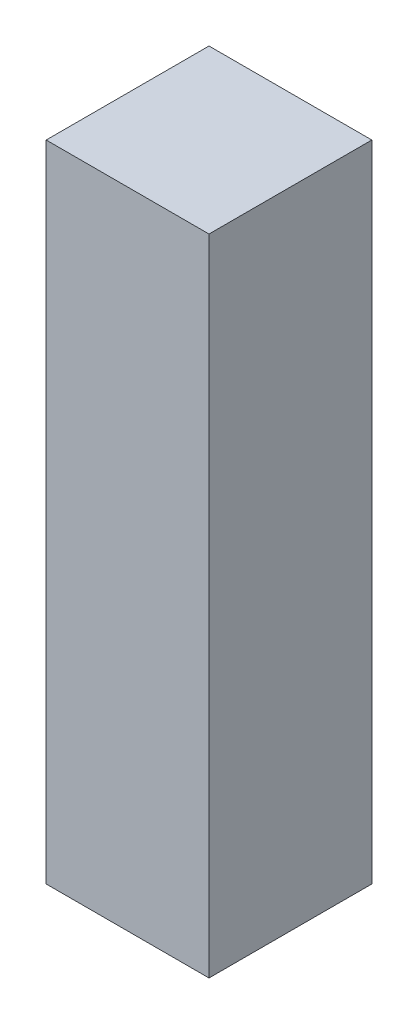
ISO-10303-21;
HEADER;
FILE_DESCRIPTION(('STEP AP214'),'2;1');
FILE_NAME('part.step','',(''),(''),'','','');
FILE_SCHEMA(('AUTOMOTIVE_DESIGN { 1 0 10303 214 1 1 1 1 }'));
ENDSEC;
DATA;
#1=APPLICATION_CONTEXT('core data for automotive mechanical design processes');
#2=APPLICATION_PROTOCOL_DEFINITION('international standard','automotive_design',2000,#1);
#3=PRODUCT_CONTEXT('',#1,'mechanical');
#4=PRODUCT('Part','Part','',(#3));
#5=PRODUCT_RELATED_PRODUCT_CATEGORY('part','',(#4));
#6=PRODUCT_DEFINITION_FORMATION('','',#4);
#7=PRODUCT_DEFINITION_CONTEXT('part definition',#1,'design');
#8=PRODUCT_DEFINITION('design','',#6,#7);
#9=PRODUCT_DEFINITION_SHAPE('','',#8);
#10=(LENGTH_UNIT() NAMED_UNIT(*) SI_UNIT(.MILLI.,.METRE.));
#11=(NAMED_UNIT(*) PLANE_ANGLE_UNIT() SI_UNIT($,.RADIAN.));
#12=(NAMED_UNIT(*) SI_UNIT($,.STERADIAN.) SOLID_ANGLE_UNIT());
#13=UNCERTAINTY_MEASURE_WITH_UNIT(LENGTH_MEASURE(1.E-05),#10,'distance_accuracy_value','');
#14=(GEOMETRIC_REPRESENTATION_CONTEXT(3) GLOBAL_UNCERTAINTY_ASSIGNED_CONTEXT((#13)) GLOBAL_UNIT_ASSIGNED_CONTEXT((#10,
#11,#12)) REPRESENTATION_CONTEXT('',''));
#15=CARTESIAN_POINT('',(0.,0.,0.));
#16=DIRECTION('',(0.,0.,1.));
#17=DIRECTION('',(1.,0.,0.));
#18=AXIS2_PLACEMENT_3D('',#15,#16,#17);
#19=CARTESIAN_POINT('',(150.,1187.25,150.));
#20=DIRECTION('',(-1.,0.,0.));
#21=DIRECTION('',(0.,0.,1.));
#22=AXIS2_PLACEMENT_3D('',#19,#20,#21);
#23=PLANE('',#22);
#24=DIRECTION('',(0.,0.,-1.));
#25=VECTOR('',#24,1.);
#26=CARTESIAN_POINT('',(150.,0.,150.));
#27=LINE('',#26,#25);
#28=CARTESIAN_POINT('',(150.,0.,150.));
#29=VERTEX_POINT('',#28);
#30=CARTESIAN_POINT('',(150.,0.,-150.));
#31=VERTEX_POINT('',#30);
#32=EDGE_CURVE('E106',#29,#31,#27,.T.);
#33=ORIENTED_EDGE('',*,*,#32,.T.);
#34=DIRECTION('',(0.,-1.,0.));
#35=VECTOR('',#34,1.);
#36=CARTESIAN_POINT('',(150.,1187.25,-150.));
#37=LINE('',#36,#35);
#38=CARTESIAN_POINT('',(150.,1187.25,-150.));
#39=VERTEX_POINT('',#38);
#40=EDGE_CURVE('E11',#39,#31,#37,.T.);
#41=ORIENTED_EDGE('',*,*,#40,.F.);
#42=DIRECTION('',(0.,0.,-1.));
#43=VECTOR('',#42,1.);
#44=CARTESIAN_POINT('',(150.,1187.25,150.));
#45=LINE('',#44,#43);
#46=CARTESIAN_POINT('',(150.,1187.25,150.));
#47=VERTEX_POINT('',#46);
#48=EDGE_CURVE('E94',#47,#39,#45,.T.);
#49=ORIENTED_EDGE('',*,*,#48,.F.);
#50=DIRECTION('',(0.,-1.,0.));
#51=VECTOR('',#50,1.);
#52=CARTESIAN_POINT('',(150.,1187.25,150.));
#53=LINE('',#52,#51);
#54=EDGE_CURVE('E102',#47,#29,#53,.T.);
#55=ORIENTED_EDGE('',*,*,#54,.T.);
#56=EDGE_LOOP('',(#33,#41,#49,#55));
#57=FACE_BOUND('',#56,.T.);
#58=ADVANCED_FACE('F43',(#57),#23,.F.);
#59=CARTESIAN_POINT('',(-150.,1187.25,-150.));
#60=DIRECTION('',(0.,0.,1.));
#61=DIRECTION('',(1.,0.,0.));
#62=AXIS2_PLACEMENT_3D('',#59,#60,#61);
#63=PLANE('',#62);
#64=DIRECTION('',(-1.,0.,0.));
#65=VECTOR('',#64,1.);
#66=CARTESIAN_POINT('',(-150.,0.,-150.));
#67=LINE('',#66,#65);
#68=CARTESIAN_POINT('',(-150.,0.,-150.));
#69=VERTEX_POINT('',#68);
#70=EDGE_CURVE('E98',#31,#69,#67,.T.);
#71=ORIENTED_EDGE('',*,*,#70,.T.);
#72=DIRECTION('',(0.,-1.,0.));
#73=VECTOR('',#72,1.);
#74=CARTESIAN_POINT('',(-150.,1187.25,-150.));
#75=LINE('',#74,#73);
#76=CARTESIAN_POINT('',(-150.,1187.25,-150.));
#77=VERTEX_POINT('',#76);
#78=EDGE_CURVE('E51',#77,#69,#75,.T.);
#79=ORIENTED_EDGE('',*,*,#78,.F.);
#80=DIRECTION('',(-1.,0.,0.));
#81=VECTOR('',#80,1.);
#82=CARTESIAN_POINT('',(-150.,1187.25,-150.));
#83=LINE('',#82,#81);
#84=EDGE_CURVE('E89',#39,#77,#83,.T.);
#85=ORIENTED_EDGE('',*,*,#84,.F.);
#86=ORIENTED_EDGE('',*,*,#40,.T.);
#87=EDGE_LOOP('',(#71,#79,#85,#86));
#88=FACE_BOUND('',#87,.T.);
#89=ADVANCED_FACE('F97',(#88),#63,.F.);
#90=CARTESIAN_POINT('',(-150.,1187.25,150.));
#91=DIRECTION('',(1.,0.,0.));
#92=DIRECTION('',(0.,0.,-1.));
#93=AXIS2_PLACEMENT_3D('',#90,#91,#92);
#94=PLANE('',#93);
#95=DIRECTION('',(0.,0.,1.));
#96=VECTOR('',#95,1.);
#97=CARTESIAN_POINT('',(-150.,0.,150.));
#98=LINE('',#97,#96);
#99=CARTESIAN_POINT('',(-150.,0.,150.));
#100=VERTEX_POINT('',#99);
#101=EDGE_CURVE('E76',#69,#100,#98,.T.);
#102=ORIENTED_EDGE('',*,*,#101,.T.);
#103=DIRECTION('',(0.,-1.,0.));
#104=VECTOR('',#103,1.);
#105=CARTESIAN_POINT('',(-150.,1187.25,150.));
#106=LINE('',#105,#104);
#107=CARTESIAN_POINT('',(-150.,1187.25,150.));
#108=VERTEX_POINT('',#107);
#109=EDGE_CURVE('E99',#108,#100,#106,.T.);
#110=ORIENTED_EDGE('',*,*,#109,.F.);
#111=DIRECTION('',(0.,0.,1.));
#112=VECTOR('',#111,1.);
#113=CARTESIAN_POINT('',(-150.,1187.25,150.));
#114=LINE('',#113,#112);
#115=EDGE_CURVE('E92',#77,#108,#114,.T.);
#116=ORIENTED_EDGE('',*,*,#115,.F.);
#117=ORIENTED_EDGE('',*,*,#78,.T.);
#118=EDGE_LOOP('',(#102,#110,#116,#117));
#119=FACE_BOUND('',#118,.T.);
#120=ADVANCED_FACE('F100',(#119),#94,.F.);
#121=CARTESIAN_POINT('',(-150.,1187.25,150.));
#122=DIRECTION('',(0.,0.,-1.));
#123=DIRECTION('',(-1.,0.,0.));
#124=AXIS2_PLACEMENT_3D('',#121,#122,#123);
#125=PLANE('',#124);
#126=DIRECTION('',(1.,0.,0.));
#127=VECTOR('',#126,1.);
#128=CARTESIAN_POINT('',(-150.,0.,150.));
#129=LINE('',#128,#127);
#130=EDGE_CURVE('E82',#100,#29,#129,.T.);
#131=ORIENTED_EDGE('',*,*,#130,.T.);
#132=ORIENTED_EDGE('',*,*,#54,.F.);
#133=DIRECTION('',(1.,0.,0.));
#134=VECTOR('',#133,1.);
#135=CARTESIAN_POINT('',(-150.,1187.25,150.));
#136=LINE('',#135,#134);
#137=EDGE_CURVE('E59',#108,#47,#136,.T.);
#138=ORIENTED_EDGE('',*,*,#137,.F.);
#139=ORIENTED_EDGE('',*,*,#109,.T.);
#140=EDGE_LOOP('',(#131,#132,#138,#139));
#141=FACE_BOUND('',#140,.T.);
#142=ADVANCED_FACE('F113',(#141),#125,.F.);
#143=CARTESIAN_POINT('',(0.,1187.25,0.));
#144=DIRECTION('',(0.,-1.,0.));
#145=DIRECTION('',(0.,0.,-1.));
#146=AXIS2_PLACEMENT_3D('',#143,#144,#145);
#147=PLANE('',#146);
#148=ORIENTED_EDGE('',*,*,#48,.T.);
#149=ORIENTED_EDGE('',*,*,#84,.T.);
#150=ORIENTED_EDGE('',*,*,#115,.T.);
#151=ORIENTED_EDGE('',*,*,#137,.T.);
#152=EDGE_LOOP('',(#148,#149,#150,#151));
#153=FACE_BOUND('',#152,.T.);
#154=ADVANCED_FACE('F90',(#153),#147,.F.);
#155=CARTESIAN_POINT('',(0.,0.,0.));
#156=DIRECTION('',(0.,-1.,0.));
#157=DIRECTION('',(0.,0.,-1.));
#158=AXIS2_PLACEMENT_3D('',#155,#156,#157);
#159=PLANE('',#158);
#160=ORIENTED_EDGE('',*,*,#32,.F.);
#161=ORIENTED_EDGE('',*,*,#130,.F.);
#162=ORIENTED_EDGE('',*,*,#101,.F.);
#163=ORIENTED_EDGE('',*,*,#70,.F.);
#164=EDGE_LOOP('',(#160,#161,#162,#163));
#165=FACE_BOUND('',#164,.T.);
#166=ADVANCED_FACE('F116',(#165),#159,.T.);
#167=CLOSED_SHELL('',(#58,#89,#120,#142,#154,#166));
#168=MANIFOLD_SOLID_BREP('B2',#167);
#169=ADVANCED_BREP_SHAPE_REPRESENTATION('',(#18,#168),#14);
#170=SHAPE_DEFINITION_REPRESENTATION(#9,#169);
ENDSEC;
END-ISO-10303-21;
